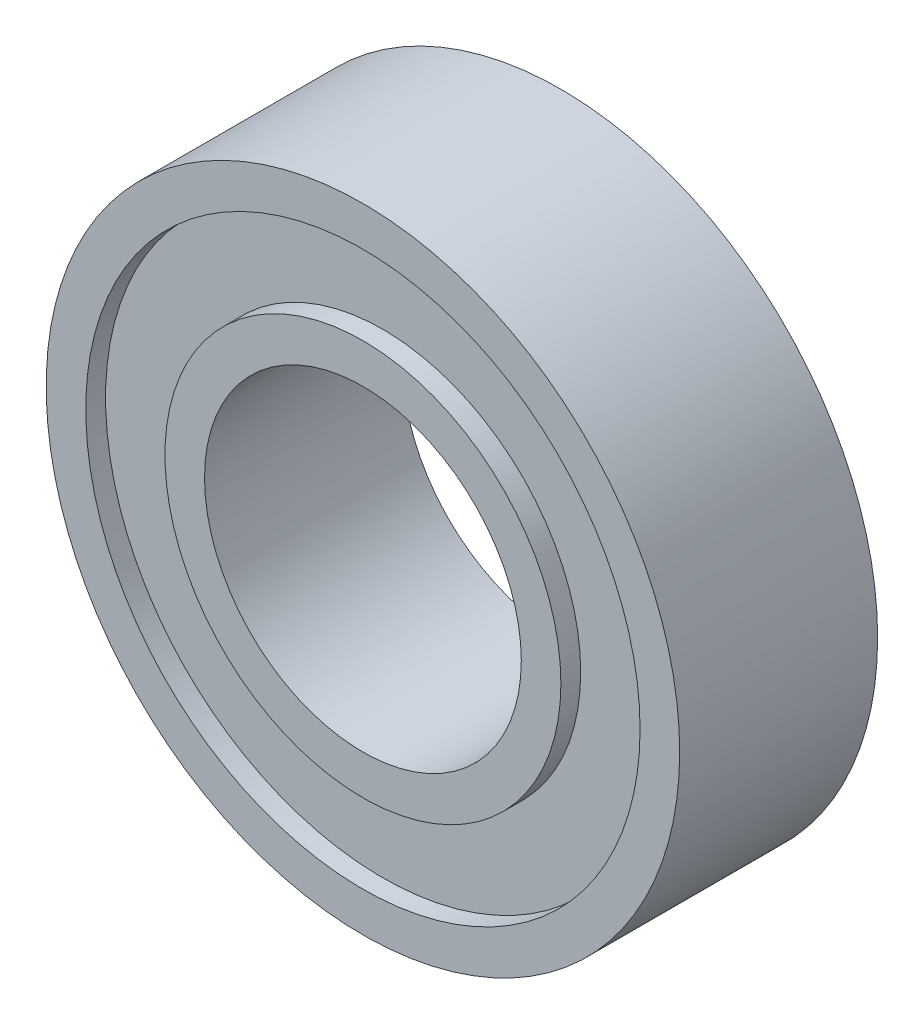
ISO-10303-21;
HEADER;
FILE_DESCRIPTION(('STEP AP214'),'2;1');
FILE_NAME('part.step','',(''),(''),'','','');
FILE_SCHEMA(('AUTOMOTIVE_DESIGN { 1 0 10303 214 1 1 1 1 }'));
ENDSEC;
DATA;
#1=APPLICATION_CONTEXT('core data for automotive mechanical design processes');
#2=APPLICATION_PROTOCOL_DEFINITION('international standard','automotive_design',2000,#1);
#3=PRODUCT_CONTEXT('',#1,'mechanical');
#4=PRODUCT('Part','Part','',(#3));
#5=PRODUCT_RELATED_PRODUCT_CATEGORY('part','',(#4));
#6=PRODUCT_DEFINITION_FORMATION('','',#4);
#7=PRODUCT_DEFINITION_CONTEXT('part definition',#1,'design');
#8=PRODUCT_DEFINITION('design','',#6,#7);
#9=PRODUCT_DEFINITION_SHAPE('','',#8);
#10=(LENGTH_UNIT() NAMED_UNIT(*) SI_UNIT(.MILLI.,.METRE.));
#11=(NAMED_UNIT(*) PLANE_ANGLE_UNIT() SI_UNIT($,.RADIAN.));
#12=(NAMED_UNIT(*) SI_UNIT($,.STERADIAN.) SOLID_ANGLE_UNIT());
#13=UNCERTAINTY_MEASURE_WITH_UNIT(LENGTH_MEASURE(1.E-05),#10,'distance_accuracy_value','');
#14=(GEOMETRIC_REPRESENTATION_CONTEXT(3) GLOBAL_UNCERTAINTY_ASSIGNED_CONTEXT((#13)) GLOBAL_UNIT_ASSIGNED_CONTEXT((#10,
#11,#12)) REPRESENTATION_CONTEXT('',''));
#15=CARTESIAN_POINT('',(0.,0.,0.));
#16=DIRECTION('',(0.,0.,1.));
#17=DIRECTION('',(1.,0.,0.));
#18=AXIS2_PLACEMENT_3D('',#15,#16,#17);
#19=CARTESIAN_POINT('',(0.,0.,0.));
#20=DIRECTION('',(0.,0.,1.));
#21=DIRECTION('',(1.,0.,0.));
#22=AXIS2_PLACEMENT_3D('',#19,#20,#21);
#23=PLANE('',#22);
#24=CARTESIAN_POINT('',(0.,0.,0.));
#25=DIRECTION('',(0.,0.,1.));
#26=DIRECTION('',(1.,0.,0.));
#27=AXIS2_PLACEMENT_3D('',#24,#25,#26);
#28=CIRCLE('',#27,4.);
#29=CARTESIAN_POINT('',(4.,0.,0.));
#30=VERTEX_POINT('',#29);
#31=EDGE_CURVE('E67',#30,#30,#28,.T.);
#32=ORIENTED_EDGE('',*,*,#31,.T.);
#33=EDGE_LOOP('',(#32));
#34=FACE_BOUND('',#33,.T.);
#35=CARTESIAN_POINT('',(0.,0.,0.));
#36=DIRECTION('',(0.,0.,-1.));
#37=DIRECTION('',(-1.,0.,0.));
#38=AXIS2_PLACEMENT_3D('',#35,#36,#37);
#39=CIRCLE('',#38,5.);
#40=CARTESIAN_POINT('',(-5.,0.,0.));
#41=VERTEX_POINT('',#40);
#42=EDGE_CURVE('E79',#41,#41,#39,.T.);
#43=ORIENTED_EDGE('',*,*,#42,.T.);
#44=EDGE_LOOP('',(#43));
#45=FACE_BOUND('',#44,.T.);
#46=ADVANCED_FACE('F36',(#34,#45),#23,.F.);
#47=CARTESIAN_POINT('',(0.,0.,5.));
#48=DIRECTION('',(0.,0.,-1.));
#49=DIRECTION('',(-1.,0.,0.));
#50=AXIS2_PLACEMENT_3D('',#47,#48,#49);
#51=CYLINDRICAL_SURFACE('',#50,7.);
#52=CARTESIAN_POINT('',(0.,0.,4.5));
#53=DIRECTION('',(0.,0.,1.));
#54=DIRECTION('',(1.,0.,0.));
#55=AXIS2_PLACEMENT_3D('',#52,#53,#54);
#56=CIRCLE('',#55,7.);
#57=CARTESIAN_POINT('',(7.,0.,4.5));
#58=VERTEX_POINT('',#57);
#59=EDGE_CURVE('E10',#58,#58,#56,.T.);
#60=ORIENTED_EDGE('',*,*,#59,.F.);
#61=EDGE_LOOP('',(#60));
#62=FACE_BOUND('',#61,.T.);
#63=CARTESIAN_POINT('',(0.,0.,5.));
#64=DIRECTION('',(0.,0.,1.));
#65=DIRECTION('',(1.,0.,0.));
#66=AXIS2_PLACEMENT_3D('',#63,#64,#65);
#67=CIRCLE('',#66,7.);
#68=CARTESIAN_POINT('',(7.,0.,5.));
#69=VERTEX_POINT('',#68);
#70=EDGE_CURVE('E47',#69,#69,#67,.T.);
#71=ORIENTED_EDGE('',*,*,#70,.T.);
#72=EDGE_LOOP('',(#71));
#73=FACE_BOUND('',#72,.T.);
#74=ADVANCED_FACE('F38',(#62,#73),#51,.F.);
#75=CARTESIAN_POINT('',(0.,0.,5.));
#76=DIRECTION('',(0.,0.,-1.));
#77=DIRECTION('',(-1.,0.,0.));
#78=AXIS2_PLACEMENT_3D('',#75,#76,#77);
#79=CYLINDRICAL_SURFACE('',#78,8.);
#80=CARTESIAN_POINT('',(0.,0.,5.));
#81=DIRECTION('',(0.,0.,1.));
#82=DIRECTION('',(1.,0.,0.));
#83=AXIS2_PLACEMENT_3D('',#80,#81,#82);
#84=CIRCLE('',#83,8.);
#85=CARTESIAN_POINT('',(8.,0.,5.));
#86=VERTEX_POINT('',#85);
#87=EDGE_CURVE('E43',#86,#86,#84,.T.);
#88=ORIENTED_EDGE('',*,*,#87,.F.);
#89=EDGE_LOOP('',(#88));
#90=FACE_BOUND('',#89,.T.);
#91=CARTESIAN_POINT('',(0.,0.,0.));
#92=DIRECTION('',(0.,0.,1.));
#93=DIRECTION('',(1.,0.,0.));
#94=AXIS2_PLACEMENT_3D('',#91,#92,#93);
#95=CIRCLE('',#94,8.);
#96=CARTESIAN_POINT('',(8.,0.,0.));
#97=VERTEX_POINT('',#96);
#98=EDGE_CURVE('E52',#97,#97,#95,.T.);
#99=ORIENTED_EDGE('',*,*,#98,.T.);
#100=EDGE_LOOP('',(#99));
#101=FACE_BOUND('',#100,.T.);
#102=ADVANCED_FACE('F114',(#90,#101),#79,.T.);
#103=CARTESIAN_POINT('',(0.,0.,5.));
#104=DIRECTION('',(0.,0.,1.));
#105=DIRECTION('',(1.,0.,0.));
#106=AXIS2_PLACEMENT_3D('',#103,#104,#105);
#107=PLANE('',#106);
#108=ORIENTED_EDGE('',*,*,#70,.F.);
#109=EDGE_LOOP('',(#108));
#110=FACE_BOUND('',#109,.T.);
#111=ORIENTED_EDGE('',*,*,#87,.T.);
#112=EDGE_LOOP('',(#111));
#113=FACE_BOUND('',#112,.T.);
#114=ADVANCED_FACE('F105',(#110,#113),#107,.T.);
#115=CARTESIAN_POINT('',(0.,0.,0.));
#116=DIRECTION('',(0.,0.,-1.));
#117=DIRECTION('',(-1.,0.,0.));
#118=AXIS2_PLACEMENT_3D('',#115,#116,#117);
#119=CIRCLE('',#118,7.);
#120=CARTESIAN_POINT('',(-7.,0.,0.));
#121=VERTEX_POINT('',#120);
#122=EDGE_CURVE('E73',#121,#121,#119,.T.);
#123=ORIENTED_EDGE('',*,*,#122,.F.);
#124=EDGE_LOOP('',(#123));
#125=FACE_BOUND('',#124,.T.);
#126=ORIENTED_EDGE('',*,*,#98,.F.);
#127=EDGE_LOOP('',(#126));
#128=FACE_BOUND('',#127,.T.);
#129=ADVANCED_FACE('F101',(#125,#128),#23,.F.);
#130=CARTESIAN_POINT('',(0.,0.,4.5));
#131=DIRECTION('',(0.,0.,1.));
#132=DIRECTION('',(1.,0.,0.));
#133=AXIS2_PLACEMENT_3D('',#130,#131,#132);
#134=PLANE('',#133);
#135=CARTESIAN_POINT('',(0.,0.,4.5));
#136=DIRECTION('',(0.,0.,1.));
#137=DIRECTION('',(1.,0.,0.));
#138=AXIS2_PLACEMENT_3D('',#135,#136,#137);
#139=CIRCLE('',#138,5.);
#140=CARTESIAN_POINT('',(5.,0.,4.5));
#141=VERTEX_POINT('',#140);
#142=EDGE_CURVE('E56',#141,#141,#139,.T.);
#143=ORIENTED_EDGE('',*,*,#142,.F.);
#144=EDGE_LOOP('',(#143));
#145=FACE_BOUND('',#144,.T.);
#146=ORIENTED_EDGE('',*,*,#59,.T.);
#147=EDGE_LOOP('',(#146));
#148=FACE_BOUND('',#147,.T.);
#149=ADVANCED_FACE('F104',(#145,#148),#134,.T.);
#150=CARTESIAN_POINT('',(0.,0.,5.));
#151=DIRECTION('',(0.,0.,-1.));
#152=DIRECTION('',(-1.,0.,0.));
#153=AXIS2_PLACEMENT_3D('',#150,#151,#152);
#154=CYLINDRICAL_SURFACE('',#153,4.);
#155=CARTESIAN_POINT('',(0.,0.,5.));
#156=DIRECTION('',(0.,0.,1.));
#157=DIRECTION('',(1.,0.,0.));
#158=AXIS2_PLACEMENT_3D('',#155,#156,#157);
#159=CIRCLE('',#158,4.);
#160=CARTESIAN_POINT('',(4.,0.,5.));
#161=VERTEX_POINT('',#160);
#162=EDGE_CURVE('E64',#161,#161,#159,.T.);
#163=ORIENTED_EDGE('',*,*,#162,.T.);
#164=EDGE_LOOP('',(#163));
#165=FACE_BOUND('',#164,.T.);
#166=ORIENTED_EDGE('',*,*,#31,.F.);
#167=EDGE_LOOP('',(#166));
#168=FACE_BOUND('',#167,.T.);
#169=ADVANCED_FACE('F111',(#165,#168),#154,.F.);
#170=CARTESIAN_POINT('',(0.,0.,5.));
#171=DIRECTION('',(0.,0.,-1.));
#172=DIRECTION('',(-1.,0.,0.));
#173=AXIS2_PLACEMENT_3D('',#170,#171,#172);
#174=CYLINDRICAL_SURFACE('',#173,5.);
#175=ORIENTED_EDGE('',*,*,#142,.T.);
#176=EDGE_LOOP('',(#175));
#177=FACE_BOUND('',#176,.T.);
#178=CARTESIAN_POINT('',(0.,0.,5.));
#179=DIRECTION('',(0.,0.,1.));
#180=DIRECTION('',(1.,0.,0.));
#181=AXIS2_PLACEMENT_3D('',#178,#179,#180);
#182=CIRCLE('',#181,5.);
#183=CARTESIAN_POINT('',(5.,0.,5.));
#184=VERTEX_POINT('',#183);
#185=EDGE_CURVE('E60',#184,#184,#182,.T.);
#186=ORIENTED_EDGE('',*,*,#185,.F.);
#187=EDGE_LOOP('',(#186));
#188=FACE_BOUND('',#187,.T.);
#189=ADVANCED_FACE('F133',(#177,#188),#174,.T.);
#190=CARTESIAN_POINT('',(0.,0.,5.));
#191=DIRECTION('',(0.,0.,1.));
#192=DIRECTION('',(1.,0.,0.));
#193=AXIS2_PLACEMENT_3D('',#190,#191,#192);
#194=PLANE('',#193);
#195=ORIENTED_EDGE('',*,*,#162,.F.);
#196=EDGE_LOOP('',(#195));
#197=FACE_BOUND('',#196,.T.);
#198=ORIENTED_EDGE('',*,*,#185,.T.);
#199=EDGE_LOOP('',(#198));
#200=FACE_BOUND('',#199,.T.);
#201=ADVANCED_FACE('F97',(#197,#200),#194,.T.);
#202=CARTESIAN_POINT('',(0.,0.,0.5));
#203=DIRECTION('',(0.,0.,-1.));
#204=DIRECTION('',(-1.,0.,0.));
#205=AXIS2_PLACEMENT_3D('',#202,#203,#204);
#206=CYLINDRICAL_SURFACE('',#205,7.);
#207=CARTESIAN_POINT('',(0.,0.,0.5));
#208=DIRECTION('',(0.,0.,-1.));
#209=DIRECTION('',(-1.,0.,0.));
#210=AXIS2_PLACEMENT_3D('',#207,#208,#209);
#211=CIRCLE('',#210,7.);
#212=CARTESIAN_POINT('',(-7.,0.,0.5));
#213=VERTEX_POINT('',#212);
#214=EDGE_CURVE('E69',#213,#213,#211,.T.);
#215=ORIENTED_EDGE('',*,*,#214,.F.);
#216=EDGE_LOOP('',(#215));
#217=FACE_BOUND('',#216,.T.);
#218=ORIENTED_EDGE('',*,*,#122,.T.);
#219=EDGE_LOOP('',(#218));
#220=FACE_BOUND('',#219,.T.);
#221=ADVANCED_FACE('F91',(#217,#220),#206,.F.);
#222=CARTESIAN_POINT('',(0.,0.,0.5));
#223=DIRECTION('',(0.,0.,-1.));
#224=DIRECTION('',(-1.,0.,0.));
#225=AXIS2_PLACEMENT_3D('',#222,#223,#224);
#226=PLANE('',#225);
#227=CARTESIAN_POINT('',(0.,0.,0.5));
#228=DIRECTION('',(0.,0.,-1.));
#229=DIRECTION('',(-1.,0.,0.));
#230=AXIS2_PLACEMENT_3D('',#227,#228,#229);
#231=CIRCLE('',#230,5.);
#232=CARTESIAN_POINT('',(-5.,0.,0.5));
#233=VERTEX_POINT('',#232);
#234=EDGE_CURVE('E76',#233,#233,#231,.T.);
#235=ORIENTED_EDGE('',*,*,#234,.F.);
#236=EDGE_LOOP('',(#235));
#237=FACE_BOUND('',#236,.T.);
#238=ORIENTED_EDGE('',*,*,#214,.T.);
#239=EDGE_LOOP('',(#238));
#240=FACE_BOUND('',#239,.T.);
#241=ADVANCED_FACE('F88',(#237,#240),#226,.T.);
#242=CARTESIAN_POINT('',(0.,0.,0.5));
#243=DIRECTION('',(0.,0.,-1.));
#244=DIRECTION('',(-1.,0.,0.));
#245=AXIS2_PLACEMENT_3D('',#242,#243,#244);
#246=CYLINDRICAL_SURFACE('',#245,5.);
#247=ORIENTED_EDGE('',*,*,#234,.T.);
#248=EDGE_LOOP('',(#247));
#249=FACE_BOUND('',#248,.T.);
#250=ORIENTED_EDGE('',*,*,#42,.F.);
#251=EDGE_LOOP('',(#250));
#252=FACE_BOUND('',#251,.T.);
#253=ADVANCED_FACE('F85',(#249,#252),#246,.T.);
#254=CLOSED_SHELL('',(#46,#74,#102,#114,#129,#149,#169,#189,#201,#221,#241,#253));
#255=MANIFOLD_SOLID_BREP('B2',#254);
#256=ADVANCED_BREP_SHAPE_REPRESENTATION('',(#18,#255),#14);
#257=SHAPE_DEFINITION_REPRESENTATION(#9,#256);
ENDSEC;
END-ISO-10303-21;
